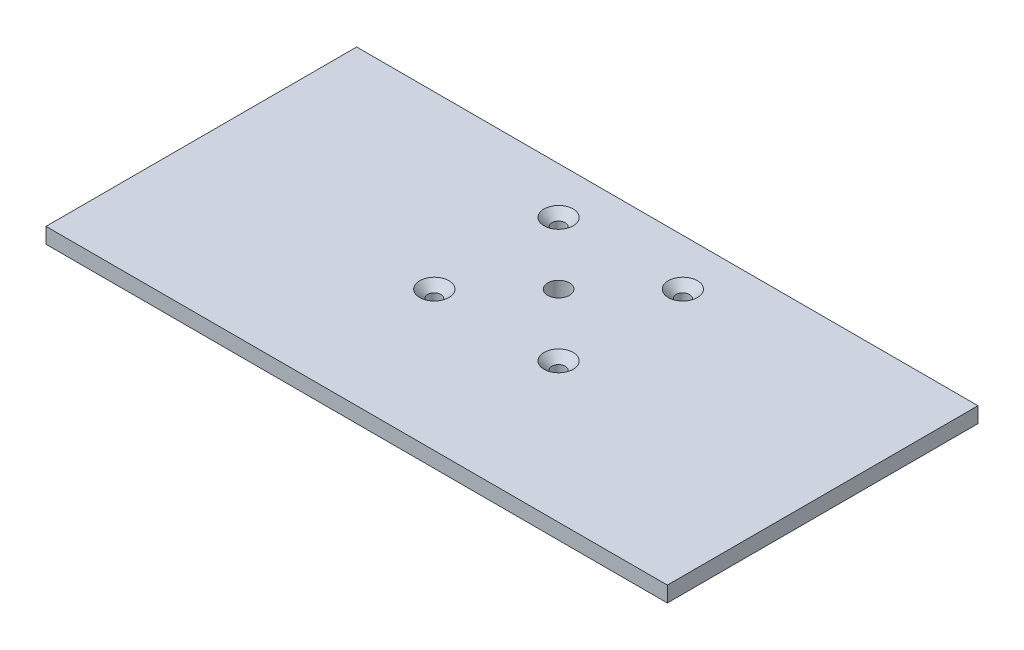
ISO-10303-21;
HEADER;
FILE_DESCRIPTION(('STEP AP214'),'2;1');
FILE_NAME('part.step','',(''),(''),'','','');
FILE_SCHEMA(('AUTOMOTIVE_DESIGN { 1 0 10303 214 1 1 1 1 }'));
ENDSEC;
DATA;
#1=APPLICATION_CONTEXT('core data for automotive mechanical design processes');
#2=APPLICATION_PROTOCOL_DEFINITION('international standard','automotive_design',2000,#1);
#3=PRODUCT_CONTEXT('',#1,'mechanical');
#4=PRODUCT('Part','Part','',(#3));
#5=PRODUCT_RELATED_PRODUCT_CATEGORY('part','',(#4));
#6=PRODUCT_DEFINITION_FORMATION('','',#4);
#7=PRODUCT_DEFINITION_CONTEXT('part definition',#1,'design');
#8=PRODUCT_DEFINITION('design','',#6,#7);
#9=PRODUCT_DEFINITION_SHAPE('','',#8);
#10=(LENGTH_UNIT() NAMED_UNIT(*) SI_UNIT(.MILLI.,.METRE.));
#11=(NAMED_UNIT(*) PLANE_ANGLE_UNIT() SI_UNIT($,.RADIAN.));
#12=(NAMED_UNIT(*) SI_UNIT($,.STERADIAN.) SOLID_ANGLE_UNIT());
#13=UNCERTAINTY_MEASURE_WITH_UNIT(LENGTH_MEASURE(1.E-05),#10,'distance_accuracy_value','');
#14=(GEOMETRIC_REPRESENTATION_CONTEXT(3) GLOBAL_UNCERTAINTY_ASSIGNED_CONTEXT((#13)) GLOBAL_UNIT_ASSIGNED_CONTEXT((#10,
#11,#12)) REPRESENTATION_CONTEXT('',''));
#15=CARTESIAN_POINT('',(0.,0.,0.));
#16=DIRECTION('',(0.,0.,1.));
#17=DIRECTION('',(1.,0.,0.));
#18=AXIS2_PLACEMENT_3D('',#15,#16,#17);
#19=CARTESIAN_POINT('',(-133.19587628866,4.99999999999999,-51.1340206185567));
#20=DIRECTION('',(1.,0.,0.));
#21=DIRECTION('',(0.,0.,-1.));
#22=AXIS2_PLACEMENT_3D('',#19,#20,#21);
#23=PLANE('',#22);
#24=DIRECTION('',(0.,0.,1.));
#25=VECTOR('',#24,1.);
#26=CARTESIAN_POINT('',(-133.19587628866,0.,-51.1340206185567));
#27=LINE('',#26,#25);
#28=CARTESIAN_POINT('',(-133.19587628866,0.,-51.1340206185567));
#29=VERTEX_POINT('',#28);
#30=CARTESIAN_POINT('',(-133.19587628866,0.,48.8659793814433));
#31=VERTEX_POINT('',#30);
#32=EDGE_CURVE('E101',#29,#31,#27,.T.);
#33=ORIENTED_EDGE('',*,*,#32,.T.);
#34=DIRECTION('',(0.,-1.,0.));
#35=VECTOR('',#34,1.);
#36=CARTESIAN_POINT('',(-133.19587628866,4.99999999999999,48.8659793814433));
#37=LINE('',#36,#35);
#38=CARTESIAN_POINT('',(-133.19587628866,4.99999999999999,48.8659793814433));
#39=VERTEX_POINT('',#38);
#40=EDGE_CURVE('E11',#39,#31,#37,.T.);
#41=ORIENTED_EDGE('',*,*,#40,.F.);
#42=DIRECTION('',(0.,0.,1.));
#43=VECTOR('',#42,1.);
#44=CARTESIAN_POINT('',(-133.19587628866,4.99999999999999,-51.1340206185567));
#45=LINE('',#44,#43);
#46=CARTESIAN_POINT('',(-133.19587628866,4.99999999999999,-51.1340206185567));
#47=VERTEX_POINT('',#46);
#48=EDGE_CURVE('E86',#47,#39,#45,.T.);
#49=ORIENTED_EDGE('',*,*,#48,.F.);
#50=DIRECTION('',(0.,-1.,0.));
#51=VECTOR('',#50,1.);
#52=CARTESIAN_POINT('',(-133.19587628866,4.99999999999999,-51.1340206185567));
#53=LINE('',#52,#51);
#54=EDGE_CURVE('E53',#47,#29,#53,.T.);
#55=ORIENTED_EDGE('',*,*,#54,.T.);
#56=EDGE_LOOP('',(#33,#41,#49,#55));
#57=FACE_BOUND('',#56,.T.);
#58=ADVANCED_FACE('F35',(#57),#23,.F.);
#59=CARTESIAN_POINT('',(-133.19587628866,4.99999999999999,48.8659793814433));
#60=DIRECTION('',(0.,0.,-1.));
#61=DIRECTION('',(-1.,0.,0.));
#62=AXIS2_PLACEMENT_3D('',#59,#60,#61);
#63=PLANE('',#62);
#64=DIRECTION('',(1.,0.,0.));
#65=VECTOR('',#64,1.);
#66=CARTESIAN_POINT('',(-133.19587628866,0.,48.8659793814433));
#67=LINE('',#66,#65);
#68=CARTESIAN_POINT('',(66.8041237113402,0.,48.8659793814433));
#69=VERTEX_POINT('',#68);
#70=EDGE_CURVE('E91',#31,#69,#67,.T.);
#71=ORIENTED_EDGE('',*,*,#70,.T.);
#72=DIRECTION('',(0.,-1.,0.));
#73=VECTOR('',#72,1.);
#74=CARTESIAN_POINT('',(66.8041237113402,4.99999999999999,48.8659793814433));
#75=LINE('',#74,#73);
#76=CARTESIAN_POINT('',(66.8041237113402,4.99999999999999,48.8659793814433));
#77=VERTEX_POINT('',#76);
#78=EDGE_CURVE('E44',#77,#69,#75,.T.);
#79=ORIENTED_EDGE('',*,*,#78,.F.);
#80=DIRECTION('',(1.,0.,0.));
#81=VECTOR('',#80,1.);
#82=CARTESIAN_POINT('',(-133.19587628866,4.99999999999999,48.8659793814433));
#83=LINE('',#82,#81);
#84=EDGE_CURVE('E78',#39,#77,#83,.T.);
#85=ORIENTED_EDGE('',*,*,#84,.F.);
#86=ORIENTED_EDGE('',*,*,#40,.T.);
#87=EDGE_LOOP('',(#71,#79,#85,#86));
#88=FACE_BOUND('',#87,.T.);
#89=ADVANCED_FACE('F90',(#88),#63,.F.);
#90=CARTESIAN_POINT('',(66.8041237113402,4.99999999999999,-51.1340206185567));
#91=DIRECTION('',(1.,0.,0.));
#92=DIRECTION('',(0.,0.,-1.));
#93=AXIS2_PLACEMENT_3D('',#90,#91,#92);
#94=PLANE('',#93);
#95=DIRECTION('',(0.,0.,1.));
#96=VECTOR('',#95,1.);
#97=CARTESIAN_POINT('',(66.8041237113402,0.,-51.1340206185567));
#98=LINE('',#97,#96);
#99=CARTESIAN_POINT('',(66.8041237113402,0.,-51.1340206185567));
#100=VERTEX_POINT('',#99);
#101=EDGE_CURVE('E105',#100,#69,#98,.T.);
#102=ORIENTED_EDGE('',*,*,#101,.F.);
#103=DIRECTION('',(0.,-1.,0.));
#104=VECTOR('',#103,1.);
#105=CARTESIAN_POINT('',(66.8041237113402,4.99999999999999,-51.1340206185567));
#106=LINE('',#105,#104);
#107=CARTESIAN_POINT('',(66.8041237113402,4.99999999999999,-51.1340206185567));
#108=VERTEX_POINT('',#107);
#109=EDGE_CURVE('E67',#108,#100,#106,.T.);
#110=ORIENTED_EDGE('',*,*,#109,.F.);
#111=DIRECTION('',(0.,0.,1.));
#112=VECTOR('',#111,1.);
#113=CARTESIAN_POINT('',(66.8041237113402,4.99999999999999,-51.1340206185567));
#114=LINE('',#113,#112);
#115=EDGE_CURVE('E85',#108,#77,#114,.T.);
#116=ORIENTED_EDGE('',*,*,#115,.T.);
#117=ORIENTED_EDGE('',*,*,#78,.T.);
#118=EDGE_LOOP('',(#102,#110,#116,#117));
#119=FACE_BOUND('',#118,.T.);
#120=ADVANCED_FACE('F95',(#119),#94,.T.);
#121=CARTESIAN_POINT('',(-133.19587628866,4.99999999999999,-51.1340206185567));
#122=DIRECTION('',(0.,0.,-1.));
#123=DIRECTION('',(-1.,0.,0.));
#124=AXIS2_PLACEMENT_3D('',#121,#122,#123);
#125=PLANE('',#124);
#126=DIRECTION('',(1.,0.,0.));
#127=VECTOR('',#126,1.);
#128=CARTESIAN_POINT('',(-133.19587628866,0.,-51.1340206185567));
#129=LINE('',#128,#127);
#130=EDGE_CURVE('E107',#29,#100,#129,.T.);
#131=ORIENTED_EDGE('',*,*,#130,.F.);
#132=ORIENTED_EDGE('',*,*,#54,.F.);
#133=DIRECTION('',(1.,0.,0.));
#134=VECTOR('',#133,1.);
#135=CARTESIAN_POINT('',(-133.19587628866,4.99999999999999,-51.1340206185567));
#136=LINE('',#135,#134);
#137=EDGE_CURVE('E96',#47,#108,#136,.T.);
#138=ORIENTED_EDGE('',*,*,#137,.T.);
#139=ORIENTED_EDGE('',*,*,#109,.T.);
#140=EDGE_LOOP('',(#131,#132,#138,#139));
#141=FACE_BOUND('',#140,.T.);
#142=ADVANCED_FACE('F155',(#141),#125,.T.);
#143=CARTESIAN_POINT('',(0.,4.99999999999999,0.));
#144=DIRECTION('',(0.,1.,0.));
#145=DIRECTION('',(0.,0.,1.));
#146=AXIS2_PLACEMENT_3D('',#143,#144,#145);
#147=PLANE('',#146);
#148=CARTESIAN_POINT('',(-33.1958762886598,4.99999999999999,-16.1340206185567));
#149=DIRECTION('',(0.,1.,0.));
#150=DIRECTION('',(0.,0.,1.));
#151=AXIS2_PLACEMENT_3D('',#148,#149,#150);
#152=CIRCLE('',#151,3.50000000000001);
#153=CARTESIAN_POINT('',(-33.1958762886598,4.99999999999999,-12.6340206185567));
#154=VERTEX_POINT('',#153);
#155=EDGE_CURVE('E283',#154,#154,#152,.T.);
#156=ORIENTED_EDGE('',*,*,#155,.F.);
#157=EDGE_LOOP('',(#156));
#158=FACE_BOUND('',#157,.T.);
#159=CARTESIAN_POINT('',(-53.1958762886598,4.99999999999999,-36.1340206185567));
#160=DIRECTION('',(0.,1.,0.));
#161=DIRECTION('',(0.,0.,1.));
#162=AXIS2_PLACEMENT_3D('',#159,#160,#161);
#163=CIRCLE('',#162,4.7);
#164=CARTESIAN_POINT('',(-53.1958762886598,4.99999999999999,-31.4340206185567));
#165=VERTEX_POINT('',#164);
#166=EDGE_CURVE('E285',#165,#165,#163,.T.);
#167=ORIENTED_EDGE('',*,*,#166,.F.);
#168=EDGE_LOOP('',(#167));
#169=FACE_BOUND('',#168,.T.);
#170=CARTESIAN_POINT('',(-13.1958762886598,4.99999999999999,-36.1340206185567));
#171=DIRECTION('',(0.,1.,0.));
#172=DIRECTION('',(0.,0.,1.));
#173=AXIS2_PLACEMENT_3D('',#170,#171,#172);
#174=CIRCLE('',#173,4.7);
#175=CARTESIAN_POINT('',(-13.1958762886598,4.99999999999999,-31.4340206185567));
#176=VERTEX_POINT('',#175);
#177=EDGE_CURVE('E128',#176,#176,#174,.T.);
#178=ORIENTED_EDGE('',*,*,#177,.F.);
#179=EDGE_LOOP('',(#178));
#180=FACE_BOUND('',#179,.T.);
#181=CARTESIAN_POINT('',(-13.1958762886598,4.99999999999999,3.86597938144328));
#182=DIRECTION('',(0.,1.,0.));
#183=DIRECTION('',(0.,0.,1.));
#184=AXIS2_PLACEMENT_3D('',#181,#182,#183);
#185=CIRCLE('',#184,4.7);
#186=CARTESIAN_POINT('',(-13.1958762886598,4.99999999999999,8.56597938144328));
#187=VERTEX_POINT('',#186);
#188=EDGE_CURVE('E121',#187,#187,#185,.T.);
#189=ORIENTED_EDGE('',*,*,#188,.F.);
#190=EDGE_LOOP('',(#189));
#191=FACE_BOUND('',#190,.T.);
#192=CARTESIAN_POINT('',(-53.1958762886598,4.99999999999999,3.86597938144328));
#193=DIRECTION('',(0.,1.,0.));
#194=DIRECTION('',(0.,0.,1.));
#195=AXIS2_PLACEMENT_3D('',#192,#193,#194);
#196=CIRCLE('',#195,4.7);
#197=CARTESIAN_POINT('',(-53.1958762886598,4.99999999999999,8.56597938144328));
#198=VERTEX_POINT('',#197);
#199=EDGE_CURVE('E117',#198,#198,#196,.T.);
#200=ORIENTED_EDGE('',*,*,#199,.F.);
#201=EDGE_LOOP('',(#200));
#202=FACE_BOUND('',#201,.T.);
#203=ORIENTED_EDGE('',*,*,#48,.T.);
#204=ORIENTED_EDGE('',*,*,#84,.T.);
#205=ORIENTED_EDGE('',*,*,#115,.F.);
#206=ORIENTED_EDGE('',*,*,#137,.F.);
#207=EDGE_LOOP('',(#203,#204,#205,#206));
#208=FACE_BOUND('',#207,.T.);
#209=ADVANCED_FACE('F82',(#158,#169,#180,#191,#202,#208),#147,.T.);
#210=CARTESIAN_POINT('',(0.,0.,0.));
#211=DIRECTION('',(0.,1.,0.));
#212=DIRECTION('',(0.,0.,1.));
#213=AXIS2_PLACEMENT_3D('',#210,#211,#212);
#214=PLANE('',#213);
#215=CARTESIAN_POINT('',(-33.1958762886598,0.,-16.1340206185567));
#216=DIRECTION('',(0.,1.,0.));
#217=DIRECTION('',(0.,0.,1.));
#218=AXIS2_PLACEMENT_3D('',#215,#216,#217);
#219=CIRCLE('',#218,3.50000000000001);
#220=CARTESIAN_POINT('',(-33.1958762886598,0.,-12.6340206185567));
#221=VERTEX_POINT('',#220);
#222=EDGE_CURVE('E281',#221,#221,#219,.T.);
#223=ORIENTED_EDGE('',*,*,#222,.T.);
#224=EDGE_LOOP('',(#223));
#225=FACE_BOUND('',#224,.T.);
#226=CARTESIAN_POINT('',(-53.1958762886598,0.,-36.1340206185567));
#227=DIRECTION('',(0.,1.,0.));
#228=DIRECTION('',(0.,0.,1.));
#229=AXIS2_PLACEMENT_3D('',#226,#227,#228);
#230=CIRCLE('',#229,2.15);
#231=CARTESIAN_POINT('',(-53.1958762886598,0.,-33.9840206185567));
#232=VERTEX_POINT('',#231);
#233=EDGE_CURVE('E38',#232,#232,#230,.T.);
#234=ORIENTED_EDGE('',*,*,#233,.T.);
#235=EDGE_LOOP('',(#234));
#236=FACE_BOUND('',#235,.T.);
#237=CARTESIAN_POINT('',(-13.1958762886598,0.,-36.1340206185567));
#238=DIRECTION('',(0.,1.,0.));
#239=DIRECTION('',(0.,0.,1.));
#240=AXIS2_PLACEMENT_3D('',#237,#238,#239);
#241=CIRCLE('',#240,2.15);
#242=CARTESIAN_POINT('',(-13.1958762886598,0.,-33.9840206185567));
#243=VERTEX_POINT('',#242);
#244=EDGE_CURVE('E119',#243,#243,#241,.T.);
#245=ORIENTED_EDGE('',*,*,#244,.T.);
#246=EDGE_LOOP('',(#245));
#247=FACE_BOUND('',#246,.T.);
#248=CARTESIAN_POINT('',(-13.1958762886598,0.,3.86597938144328));
#249=DIRECTION('',(0.,1.,0.));
#250=DIRECTION('',(0.,0.,1.));
#251=AXIS2_PLACEMENT_3D('',#248,#249,#250);
#252=CIRCLE('',#251,2.15);
#253=CARTESIAN_POINT('',(-13.1958762886598,0.,6.01597938144328));
#254=VERTEX_POINT('',#253);
#255=EDGE_CURVE('E115',#254,#254,#252,.T.);
#256=ORIENTED_EDGE('',*,*,#255,.T.);
#257=EDGE_LOOP('',(#256));
#258=FACE_BOUND('',#257,.T.);
#259=CARTESIAN_POINT('',(-53.1958762886598,0.,3.86597938144328));
#260=DIRECTION('',(0.,1.,0.));
#261=DIRECTION('',(0.,0.,1.));
#262=AXIS2_PLACEMENT_3D('',#259,#260,#261);
#263=CIRCLE('',#262,2.15);
#264=CARTESIAN_POINT('',(-53.1958762886598,0.,6.01597938144328));
#265=VERTEX_POINT('',#264);
#266=EDGE_CURVE('E103',#265,#265,#263,.T.);
#267=ORIENTED_EDGE('',*,*,#266,.T.);
#268=EDGE_LOOP('',(#267));
#269=FACE_BOUND('',#268,.T.);
#270=ORIENTED_EDGE('',*,*,#32,.F.);
#271=ORIENTED_EDGE('',*,*,#130,.T.);
#272=ORIENTED_EDGE('',*,*,#101,.T.);
#273=ORIENTED_EDGE('',*,*,#70,.F.);
#274=EDGE_LOOP('',(#270,#271,#272,#273));
#275=FACE_BOUND('',#274,.T.);
#276=ADVANCED_FACE('F154',(#225,#236,#247,#258,#269,#275),#214,.F.);
#277=CARTESIAN_POINT('',(-53.1958762886598,4.99999999999999,3.86597938144328));
#278=DIRECTION('',(0.,1.,0.));
#279=DIRECTION('',(0.,0.,1.));
#280=AXIS2_PLACEMENT_3D('',#277,#278,#279);
#281=CYLINDRICAL_SURFACE('',#280,2.15);
#282=CARTESIAN_POINT('',(-53.1958762886598,2.44999999999999,3.86597938144328));
#283=DIRECTION('',(0.,1.,0.));
#284=DIRECTION('',(0.,0.,1.));
#285=AXIS2_PLACEMENT_3D('',#282,#283,#284);
#286=CIRCLE('',#285,2.15);
#287=CARTESIAN_POINT('',(-53.1958762886598,2.44999999999999,6.01597938144328));
#288=VERTEX_POINT('',#287);
#289=EDGE_CURVE('E114',#288,#288,#286,.T.);
#290=ORIENTED_EDGE('',*,*,#289,.T.);
#291=EDGE_LOOP('',(#290));
#292=FACE_BOUND('',#291,.T.);
#293=ORIENTED_EDGE('',*,*,#266,.F.);
#294=EDGE_LOOP('',(#293));
#295=FACE_BOUND('',#294,.T.);
#296=ADVANCED_FACE('F143',(#292,#295),#281,.F.);
#297=CARTESIAN_POINT('',(-53.1958762886598,4.99999999999999,3.86597938144328));
#298=DIRECTION('',(0.,1.,0.));
#299=DIRECTION('',(0.,0.,1.));
#300=AXIS2_PLACEMENT_3D('',#297,#298,#299);
#301=CONICAL_SURFACE('',#300,4.7,0.785398163397447);
#302=ORIENTED_EDGE('',*,*,#289,.F.);
#303=EDGE_LOOP('',(#302));
#304=FACE_BOUND('',#303,.T.);
#305=ORIENTED_EDGE('',*,*,#199,.T.);
#306=EDGE_LOOP('',(#305));
#307=FACE_BOUND('',#306,.T.);
#308=ADVANCED_FACE('F146',(#304,#307),#301,.F.);
#309=CARTESIAN_POINT('',(-13.1958762886598,4.99999999999999,3.86597938144328));
#310=DIRECTION('',(0.,1.,0.));
#311=DIRECTION('',(0.,0.,1.));
#312=AXIS2_PLACEMENT_3D('',#309,#310,#311);
#313=CYLINDRICAL_SURFACE('',#312,2.15);
#314=CARTESIAN_POINT('',(-13.1958762886598,2.44999999999999,3.86597938144328));
#315=DIRECTION('',(0.,1.,0.));
#316=DIRECTION('',(0.,0.,1.));
#317=AXIS2_PLACEMENT_3D('',#314,#315,#316);
#318=CIRCLE('',#317,2.15);
#319=CARTESIAN_POINT('',(-13.1958762886598,2.44999999999999,6.01597938144328));
#320=VERTEX_POINT('',#319);
#321=EDGE_CURVE('E118',#320,#320,#318,.T.);
#322=ORIENTED_EDGE('',*,*,#321,.T.);
#323=EDGE_LOOP('',(#322));
#324=FACE_BOUND('',#323,.T.);
#325=ORIENTED_EDGE('',*,*,#255,.F.);
#326=EDGE_LOOP('',(#325));
#327=FACE_BOUND('',#326,.T.);
#328=ADVANCED_FACE('F149',(#324,#327),#313,.F.);
#329=CARTESIAN_POINT('',(-13.1958762886598,4.99999999999999,3.86597938144328));
#330=DIRECTION('',(0.,1.,0.));
#331=DIRECTION('',(0.,0.,1.));
#332=AXIS2_PLACEMENT_3D('',#329,#330,#331);
#333=CONICAL_SURFACE('',#332,4.7,0.785398163397448);
#334=ORIENTED_EDGE('',*,*,#321,.F.);
#335=EDGE_LOOP('',(#334));
#336=FACE_BOUND('',#335,.T.);
#337=ORIENTED_EDGE('',*,*,#188,.T.);
#338=EDGE_LOOP('',(#337));
#339=FACE_BOUND('',#338,.T.);
#340=ADVANCED_FACE('F207',(#336,#339),#333,.F.);
#341=CARTESIAN_POINT('',(-13.1958762886598,4.99999999999999,-36.1340206185567));
#342=DIRECTION('',(0.,1.,0.));
#343=DIRECTION('',(0.,0.,1.));
#344=AXIS2_PLACEMENT_3D('',#341,#342,#343);
#345=CYLINDRICAL_SURFACE('',#344,2.15);
#346=CARTESIAN_POINT('',(-13.1958762886598,2.44999999999999,-36.1340206185567));
#347=DIRECTION('',(0.,1.,0.));
#348=DIRECTION('',(0.,0.,1.));
#349=AXIS2_PLACEMENT_3D('',#346,#347,#348);
#350=CIRCLE('',#349,2.15);
#351=CARTESIAN_POINT('',(-13.1958762886598,2.44999999999999,-33.9840206185567));
#352=VERTEX_POINT('',#351);
#353=EDGE_CURVE('E122',#352,#352,#350,.T.);
#354=ORIENTED_EDGE('',*,*,#353,.T.);
#355=EDGE_LOOP('',(#354));
#356=FACE_BOUND('',#355,.T.);
#357=ORIENTED_EDGE('',*,*,#244,.F.);
#358=EDGE_LOOP('',(#357));
#359=FACE_BOUND('',#358,.T.);
#360=ADVANCED_FACE('F217',(#356,#359),#345,.F.);
#361=CARTESIAN_POINT('',(-13.1958762886598,4.99999999999999,-36.1340206185567));
#362=DIRECTION('',(0.,1.,0.));
#363=DIRECTION('',(0.,0.,1.));
#364=AXIS2_PLACEMENT_3D('',#361,#362,#363);
#365=CONICAL_SURFACE('',#364,4.7,0.785398163397448);
#366=ORIENTED_EDGE('',*,*,#353,.F.);
#367=EDGE_LOOP('',(#366));
#368=FACE_BOUND('',#367,.T.);
#369=ORIENTED_EDGE('',*,*,#177,.T.);
#370=EDGE_LOOP('',(#369));
#371=FACE_BOUND('',#370,.T.);
#372=ADVANCED_FACE('F227',(#368,#371),#365,.F.);
#373=CARTESIAN_POINT('',(-53.1958762886598,4.99999999999999,-36.1340206185567));
#374=DIRECTION('',(0.,1.,0.));
#375=DIRECTION('',(0.,0.,1.));
#376=AXIS2_PLACEMENT_3D('',#373,#374,#375);
#377=CYLINDRICAL_SURFACE('',#376,2.15);
#378=CARTESIAN_POINT('',(-53.1958762886598,2.44999999999999,-36.1340206185567));
#379=DIRECTION('',(0.,1.,0.));
#380=DIRECTION('',(0.,0.,1.));
#381=AXIS2_PLACEMENT_3D('',#378,#379,#380);
#382=CIRCLE('',#381,2.15);
#383=CARTESIAN_POINT('',(-53.1958762886598,2.44999999999999,-33.9840206185567));
#384=VERTEX_POINT('',#383);
#385=EDGE_CURVE('E289',#384,#384,#382,.T.);
#386=ORIENTED_EDGE('',*,*,#385,.T.);
#387=EDGE_LOOP('',(#386));
#388=FACE_BOUND('',#387,.T.);
#389=ORIENTED_EDGE('',*,*,#233,.F.);
#390=EDGE_LOOP('',(#389));
#391=FACE_BOUND('',#390,.T.);
#392=ADVANCED_FACE('F236',(#388,#391),#377,.F.);
#393=CARTESIAN_POINT('',(-53.1958762886598,4.99999999999999,-36.1340206185567));
#394=DIRECTION('',(0.,1.,0.));
#395=DIRECTION('',(0.,0.,1.));
#396=AXIS2_PLACEMENT_3D('',#393,#394,#395);
#397=CONICAL_SURFACE('',#396,4.7,0.785398163397447);
#398=ORIENTED_EDGE('',*,*,#385,.F.);
#399=EDGE_LOOP('',(#398));
#400=FACE_BOUND('',#399,.T.);
#401=ORIENTED_EDGE('',*,*,#166,.T.);
#402=EDGE_LOOP('',(#401));
#403=FACE_BOUND('',#402,.T.);
#404=ADVANCED_FACE('F246',(#400,#403),#397,.F.);
#405=CARTESIAN_POINT('',(-33.1958762886598,0.,-16.1340206185567));
#406=DIRECTION('',(0.,1.,0.));
#407=DIRECTION('',(0.,0.,1.));
#408=AXIS2_PLACEMENT_3D('',#405,#406,#407);
#409=CYLINDRICAL_SURFACE('',#408,3.50000000000001);
#410=ORIENTED_EDGE('',*,*,#222,.F.);
#411=EDGE_LOOP('',(#410));
#412=FACE_BOUND('',#411,.T.);
#413=ORIENTED_EDGE('',*,*,#155,.T.);
#414=EDGE_LOOP('',(#413));
#415=FACE_BOUND('',#414,.T.);
#416=ADVANCED_FACE('F255',(#412,#415),#409,.F.);
#417=CLOSED_SHELL('',(#58,#89,#120,#142,#209,#276,#296,#308,#328,#340,#360,#372,#392,#404,#416));
#418=MANIFOLD_SOLID_BREP('B2',#417);
#419=ADVANCED_BREP_SHAPE_REPRESENTATION('',(#18,#418),#14);
#420=SHAPE_DEFINITION_REPRESENTATION(#9,#419);
ENDSEC;
END-ISO-10303-21;
